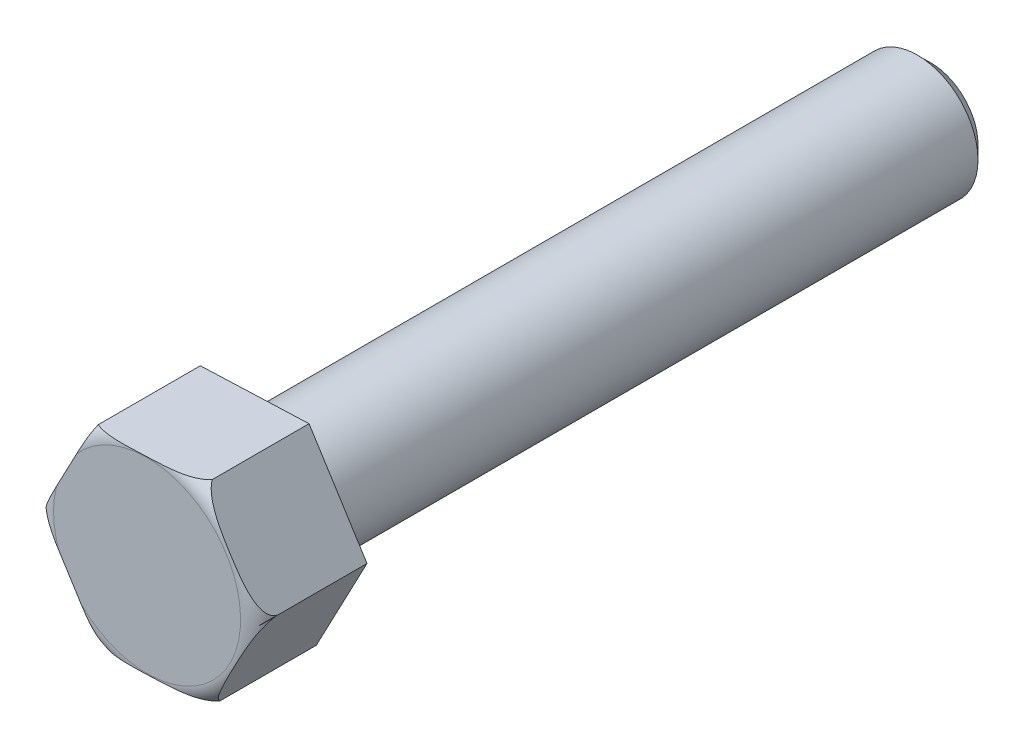
ISO-10303-21;
HEADER;
FILE_DESCRIPTION(('STEP AP214'),'2;1');
FILE_NAME('part.step','',(''),(''),'','','');
FILE_SCHEMA(('AUTOMOTIVE_DESIGN { 1 0 10303 214 1 1 1 1 }'));
ENDSEC;
DATA;
#1=APPLICATION_CONTEXT('core data for automotive mechanical design processes');
#2=APPLICATION_PROTOCOL_DEFINITION('international standard','automotive_design',2000,#1);
#3=PRODUCT_CONTEXT('',#1,'mechanical');
#4=PRODUCT('Part','Part','',(#3));
#5=PRODUCT_RELATED_PRODUCT_CATEGORY('part','',(#4));
#6=PRODUCT_DEFINITION_FORMATION('','',#4);
#7=PRODUCT_DEFINITION_CONTEXT('part definition',#1,'design');
#8=PRODUCT_DEFINITION('design','',#6,#7);
#9=PRODUCT_DEFINITION_SHAPE('','',#8);
#10=(LENGTH_UNIT() NAMED_UNIT(*) SI_UNIT(.MILLI.,.METRE.));
#11=(NAMED_UNIT(*) PLANE_ANGLE_UNIT() SI_UNIT($,.RADIAN.));
#12=(NAMED_UNIT(*) SI_UNIT($,.STERADIAN.) SOLID_ANGLE_UNIT());
#13=UNCERTAINTY_MEASURE_WITH_UNIT(LENGTH_MEASURE(1.E-05),#10,'distance_accuracy_value','');
#14=(GEOMETRIC_REPRESENTATION_CONTEXT(3) GLOBAL_UNCERTAINTY_ASSIGNED_CONTEXT((#13)) GLOBAL_UNIT_ASSIGNED_CONTEXT((#10,
#11,#12)) REPRESENTATION_CONTEXT('',''));
#15=CARTESIAN_POINT('',(0.,0.,0.));
#16=DIRECTION('',(0.,0.,1.));
#17=DIRECTION('',(1.,0.,0.));
#18=AXIS2_PLACEMENT_3D('',#15,#16,#17);
#19=CARTESIAN_POINT('',(0.,0.,29.));
#20=DIRECTION('',(0.,0.,1.));
#21=DIRECTION('',(1.,0.,0.));
#22=AXIS2_PLACEMENT_3D('',#19,#20,#21);
#23=PLANE('',#22);
#24=CARTESIAN_POINT('',(-0.134541740716779,0.,29.));
#25=DIRECTION('',(0.,0.,1.));
#26=DIRECTION('',(1.,0.,0.));
#27=AXIS2_PLACEMENT_3D('',#24,#25,#26);
#28=CIRCLE('',#27,3.47599362504416);
#29=CARTESIAN_POINT('',(-3.41445546254765,-1.15095510715806,29.));
#30=VERTEX_POINT('',#29);
#31=CARTESIAN_POINT('',(-3.49895630302121,0.8736397050853,29.));
#32=VERTEX_POINT('',#31);
#33=EDGE_CURVE('E226',#30,#32,#28,.F.);
#34=ORIENTED_EDGE('',*,*,#33,.F.);
#35=DIRECTION('',(0.53289686923062,-0.846180197572718,0.));
#36=VECTOR('',#35,1.);
#37=CARTESIAN_POINT('',(-4.04145188432738,-0.155355420440145,29.));
#38=LINE('',#37,#36);
#39=CARTESIAN_POINT('',(-2.58959470090721,-2.46074107618169,29.));
#40=VERTEX_POINT('',#39);
#41=EDGE_CURVE('E243',#30,#40,#38,.T.);
#42=ORIENTED_EDGE('',*,*,#41,.T.);
#43=CARTESIAN_POINT('',(-2.75628795762435,2.28231865774227,29.));
#44=VERTEX_POINT('',#43);
#45=EDGE_CURVE('E223',#44,#40,#28,.F.);
#46=ORIENTED_EDGE('',*,*,#45,.F.);
#47=DIRECTION('',(-0.466365112661999,-0.884592325137269,0.));
#48=VECTOR('',#47,1.);
#49=CARTESIAN_POINT('',(-2.15526768288047,3.42232228977993,29.));
#50=LINE('',#49,#48);
#51=EDGE_CURVE('E239',#44,#32,#50,.T.);
#52=ORIENTED_EDGE('',*,*,#51,.T.);
#53=EDGE_LOOP('',(#34,#42,#46,#52));
#54=FACE_BOUND('',#53,.T.);
#55=ADVANCED_FACE('F39',(#54),#23,.T.);
#56=CARTESIAN_POINT('',(0.,0.,25.));
#57=DIRECTION('',(0.,0.,-1.));
#58=DIRECTION('',(-1.,0.,0.));
#59=AXIS2_PLACEMENT_3D('',#56,#57,#58);
#60=CYLINDRICAL_SURFACE('',#59,2.25);
#61=CARTESIAN_POINT('',(0.,0.,0.5));
#62=DIRECTION('',(0.,0.,1.));
#63=DIRECTION('',(1.,0.,0.));
#64=AXIS2_PLACEMENT_3D('',#61,#62,#63);
#65=CIRCLE('',#64,2.25);
#66=CARTESIAN_POINT('',(2.25,0.,0.5));
#67=VERTEX_POINT('',#66);
#68=EDGE_CURVE('E48',#67,#67,#65,.T.);
#69=ORIENTED_EDGE('',*,*,#68,.T.);
#70=EDGE_LOOP('',(#69));
#71=FACE_BOUND('',#70,.T.);
#72=CARTESIAN_POINT('',(0.,0.,25.));
#73=DIRECTION('',(0.,0.,1.));
#74=DIRECTION('',(1.,0.,0.));
#75=AXIS2_PLACEMENT_3D('',#72,#73,#74);
#76=CIRCLE('',#75,2.25);
#77=CARTESIAN_POINT('',(2.25,0.,25.));
#78=VERTEX_POINT('',#77);
#79=EDGE_CURVE('E221',#78,#78,#76,.T.);
#80=ORIENTED_EDGE('',*,*,#79,.F.);
#81=EDGE_LOOP('',(#80));
#82=FACE_BOUND('',#81,.T.);
#83=ADVANCED_FACE('F208',(#71,#82),#60,.T.);
#84=CARTESIAN_POINT('',(0.,0.,0.));
#85=DIRECTION('',(0.,0.,1.));
#86=DIRECTION('',(1.,0.,0.));
#87=AXIS2_PLACEMENT_3D('',#84,#85,#86);
#88=PLANE('',#87);
#89=CARTESIAN_POINT('',(0.,0.,0.));
#90=DIRECTION('',(0.,0.,1.));
#91=DIRECTION('',(1.,0.,0.));
#92=AXIS2_PLACEMENT_3D('',#89,#90,#91);
#93=CIRCLE('',#92,1.75);
#94=CARTESIAN_POINT('',(1.75,0.,0.));
#95=VERTEX_POINT('',#94);
#96=EDGE_CURVE('E11',#95,#95,#93,.F.);
#97=ORIENTED_EDGE('',*,*,#96,.T.);
#98=EDGE_LOOP('',(#97));
#99=FACE_BOUND('',#98,.T.);
#100=ADVANCED_FACE('F205',(#99),#88,.F.);
#101=CARTESIAN_POINT('',(4.04145188432738,0.155355420440146,29.));
#102=DIRECTION('',(-0.846180197572718,-0.53289686923062,0.));
#103=DIRECTION('',(0.53289686923062,-0.846180197572718,0.));
#104=AXIS2_PLACEMENT_3D('',#101,#102,#103);
#105=PLANE('',#104);
#106=DIRECTION('',(0.,0.,-1.));
#107=VECTOR('',#106,1.);
#108=CARTESIAN_POINT('',(1.88618420144691,3.57767771022007,29.));
#109=LINE('',#108,#107);
#110=CARTESIAN_POINT('',(1.88618420143579,3.57767771021965,28.59903431723));
#111=VERTEX_POINT('',#110);
#112=CARTESIAN_POINT('',(1.88618420144691,3.57767771022007,25.));
#113=VERTEX_POINT('',#112);
#114=EDGE_CURVE('E224',#111,#113,#109,.T.);
#115=ORIENTED_EDGE('',*,*,#114,.F.);
#116=CARTESIAN_POINT('',(1.88605824792773,3.57787771021988,28.5987967175314));
#117=CARTESIAN_POINT('',(1.89754389041783,3.5596398038018,28.6204264055522));
#118=CARTESIAN_POINT('',(1.90980538986126,3.54016992394201,28.6404683800975));
#119=CARTESIAN_POINT('',(1.93543757539687,3.49946890077394,28.6776430461389));
#120=CARTESIAN_POINT('',(1.94880265920132,3.47824665326749,28.6947892308748));
#121=CARTESIAN_POINT('',(1.9760475484688,3.43498483824408,28.7263272101482));
#122=CARTESIAN_POINT('',(1.98991214709032,3.41296941747842,28.7407663717004));
#123=CARTESIAN_POINT('',(2.01820565504884,3.36804251410041,28.7676270409243));
#124=CARTESIAN_POINT('',(2.0326353521958,3.34512978053461,28.7800455977092));
#125=CARTESIAN_POINT('',(2.07809314796832,3.27294792166284,28.815917882112));
#126=CARTESIAN_POINT('',(2.10979695447209,3.22260584836468,28.8363522266094));
#127=CARTESIAN_POINT('',(2.17408304467043,3.12052677894972,28.8714601698475));
#128=CARTESIAN_POINT('',(2.20666625984897,3.06878830374131,28.8861273817633));
#129=CARTESIAN_POINT('',(2.27277899089453,2.96380873443182,28.9113444949774));
#130=CARTESIAN_POINT('',(2.30631537059651,2.91055674133403,28.9218294180791));
#131=CARTESIAN_POINT('',(2.37363640259678,2.80365852622343,28.9395172016005));
#132=CARTESIAN_POINT('',(2.40742115489796,2.75001214541727,28.9467186570918));
#133=CARTESIAN_POINT('',(2.4844469825085,2.62770380812154,28.9603722936265));
#134=CARTESIAN_POINT('',(2.52772473015397,2.55898362009339,28.9660692584796));
#135=CARTESIAN_POINT('',(2.61435610918697,2.42142274920297,28.9748916900608));
#136=CARTESIAN_POINT('',(2.6577097551143,2.35258204325314,28.9780165934975));
#137=CARTESIAN_POINT('',(2.74416321008174,2.21530369573572,28.9825682556101));
#138=CARTESIAN_POINT('',(2.78726287070522,2.14686628983699,28.9840057390161));
#139=CARTESIAN_POINT('',(2.87346312256001,2.00999000033916,28.9856918534697));
#140=CARTESIAN_POINT('',(2.91656371323393,1.94155111762511,28.9859406074722));
#141=CARTESIAN_POINT('',(3.0192204042425,1.77854385656686,28.9852525937358));
#142=CARTESIAN_POINT('',(3.0787762673785,1.68397585486742,28.9838269222321));
#143=CARTESIAN_POINT('',(3.19795496793975,1.49473350384183,28.977971064666));
#144=CARTESIAN_POINT('',(3.25757773849564,1.40005926069671,28.9735355895304));
#145=CARTESIAN_POINT('',(3.37445626927127,1.21446932017684,28.9595033607756));
#146=CARTESIAN_POINT('',(3.43171735430219,1.12354516760179,28.9501053258335));
#147=CARTESIAN_POINT('',(3.51716289464539,0.987867274966186,28.9294814592153));
#148=CARTESIAN_POINT('',(3.54556542883472,0.942767250215448,28.9215210116692));
#149=CARTESIAN_POINT('',(3.60209886958878,0.852998514783018,28.9027640616494));
#150=CARTESIAN_POINT('',(3.6302298776358,0.808329642958875,28.8919686649389));
#151=CARTESIAN_POINT('',(3.69163624370004,0.710823251068298,28.8642103303045));
#152=CARTESIAN_POINT('',(3.72481171773421,0.658144335515039,28.8464446425068));
#153=CARTESIAN_POINT('',(3.78987084569985,0.55483776920821,28.8038098454119));
#154=CARTESIAN_POINT('',(3.82175636447796,0.504207157288253,28.7789514417922));
#155=CARTESIAN_POINT('',(3.87090621633324,0.426162729266723,28.7311777801488));
#156=CARTESIAN_POINT('',(3.88900487572805,0.397424096959471,28.7113164594525));
#157=CARTESIAN_POINT('',(3.92365507684988,0.342403480918829,28.6672429209368));
#158=CARTESIAN_POINT('',(3.94020851689363,0.316118482872292,28.643036151381));
#159=CARTESIAN_POINT('',(3.96641130822286,0.274511401982628,28.5972783407121));
#160=CARTESIAN_POINT('',(3.97667469247709,0.258214303955872,28.5769759766737));
#161=CARTESIAN_POINT('',(3.99543148333395,0.228430633025311,28.5336472632991));
#162=CARTESIAN_POINT('',(4.00392742501646,0.214940034700247,28.5106248907424));
#163=CARTESIAN_POINT('',(4.01689369476154,0.194351058993725,28.4673796883132));
#164=CARTESIAN_POINT('',(4.02183866761014,0.186498999160716,28.4476608222074));
#165=CARTESIAN_POINT('',(4.0299227889987,0.173662325070953,28.4069730122953));
#166=CARTESIAN_POINT('',(4.0330661611034,0.168671004269159,28.3860071204826));
#167=CARTESIAN_POINT('',(4.03624027855567,0.163630863318887,28.3540066203126));
#168=CARTESIAN_POINT('',(4.0370415405843,0.162358549479494,28.3432273814894));
#169=CARTESIAN_POINT('',(4.03811211666866,0.16065859525778,28.3215676101235));
#170=CARTESIAN_POINT('',(4.03838099251025,0.160231650710169,28.3106870015363));
#171=CARTESIAN_POINT('',(4.03837642421509,0.160238904648268,28.2998));
#172=B_SPLINE_CURVE_WITH_KNOTS('',3,(#116,#117,#118,#119,#120,#121,#122,#123,#124,#125,#126,
#127,#128,#129,#130,#131,#132,#133,#134,#135,#136,#137,#138,#139,#140,#141,#142,#143,#144,#145,
#146,#147,#148,#149,#150,#151,#152,#153,#154,#155,#156,#157,#158,#159,#160,#161,#162,#163,#164,
#165,#166,#167,#168,#169,#170,#171),.UNSPECIFIED.,.F.,.F.,(4,2,2,2,2,2,2,2,2,2,2,2,2,2,2,2,2,2,
2,2,2,2,2,2,2,2,2,4),(0.,0.091389862568128,0.182341375085829,0.271511642273586,
0.360810986840683,0.549056915824058,0.7375107349661,0.928787987494082,1.12014700700023,
1.36431456889584,1.60853559020222,1.85119586517972,2.09383104032964,2.42910615715637,
2.76497197783846,3.08830804909561,3.24991914906838,3.41146730651158,3.60541778104787,
3.79907704334962,3.91686815162064,4.03451259360151,4.11821587737106,4.20179826316867,
4.26692904688313,4.33190651068713,4.36451615910714,4.39715263782286),.UNSPECIFIED.);
#173=CARTESIAN_POINT('',(4.03837645466419,0.160238856298519,28.3));
#174=VERTEX_POINT('',#173);
#175=EDGE_CURVE('E187',#111,#174,#172,.T.);
#176=ORIENTED_EDGE('',*,*,#175,.T.);
#177=DIRECTION('',(0.,0.,1.));
#178=VECTOR('',#177,1.);
#179=CARTESIAN_POINT('',(4.03837645466419,0.160238856298518,29.));
#180=LINE('',#179,#178);
#181=CARTESIAN_POINT('',(4.03837645466419,0.160238856298519,29.));
#182=VERTEX_POINT('',#181);
#183=EDGE_CURVE('E126',#174,#182,#180,.T.);
#184=ORIENTED_EDGE('',*,*,#183,.T.);
#185=DIRECTION('',(-0.53289686923062,0.846180197572718,0.));
#186=VECTOR('',#185,1.);
#187=CARTESIAN_POINT('',(4.04145188432738,0.155355420440146,29.));
#188=LINE('',#187,#186);
#189=CARTESIAN_POINT('',(4.04145188432738,0.155355420440146,29.));
#190=VERTEX_POINT('',#189);
#191=EDGE_CURVE('E244',#190,#182,#188,.T.);
#192=ORIENTED_EDGE('',*,*,#191,.F.);
#193=DIRECTION('',(0.,0.,-1.));
#194=VECTOR('',#193,1.);
#195=CARTESIAN_POINT('',(4.04145188432738,0.155355420440146,29.));
#196=LINE('',#195,#194);
#197=CARTESIAN_POINT('',(4.04145188432738,0.155355420440146,25.));
#198=VERTEX_POINT('',#197);
#199=EDGE_CURVE('E251',#190,#198,#196,.T.);
#200=ORIENTED_EDGE('',*,*,#199,.T.);
#201=DIRECTION('',(-0.53289686923062,0.846180197572718,0.));
#202=VECTOR('',#201,1.);
#203=CARTESIAN_POINT('',(4.04145188432738,0.155355420440146,25.));
#204=LINE('',#203,#202);
#205=EDGE_CURVE('E252',#198,#113,#204,.T.);
#206=ORIENTED_EDGE('',*,*,#205,.T.);
#207=EDGE_LOOP('',(#115,#176,#184,#192,#200,#206));
#208=FACE_BOUND('',#207,.T.);
#209=ADVANCED_FACE('F199',(#208),#105,.F.);
#210=CARTESIAN_POINT('',(1.88618420144691,3.57767771022007,29.));
#211=DIRECTION('',(0.038412127564552,-0.999261981892619,0.));
#212=DIRECTION('',(0.999261981892619,0.038412127564552,0.));
#213=AXIS2_PLACEMENT_3D('',#210,#211,#212);
#214=PLANE('',#213);
#215=DIRECTION('',(0.,0.,-1.));
#216=VECTOR('',#215,1.);
#217=CARTESIAN_POINT('',(-2.15526768288047,3.42232228977993,29.));
#218=LINE('',#217,#216);
#219=CARTESIAN_POINT('',(-2.15526768288047,3.42232228977992,28.791548776765));
#220=VERTEX_POINT('',#219);
#221=CARTESIAN_POINT('',(-2.15526768288047,3.42232228977993,25.));
#222=VERTEX_POINT('',#221);
#223=EDGE_CURVE('E228',#220,#222,#218,.T.);
#224=ORIENTED_EDGE('',*,*,#223,.F.);
#225=CARTESIAN_POINT('',(-2.15546768288047,3.42231460168046,28.791452365884));
#226=CARTESIAN_POINT('',(-2.11423152706038,3.42389974001889,28.8112789825461));
#227=CARTESIAN_POINT('',(-2.07200122137732,3.42552309397249,28.8288229624919));
#228=CARTESIAN_POINT('',(-1.98625531726741,3.428819209172,28.860039077984));
#229=CARTESIAN_POINT('',(-1.94274365265741,3.43049181920003,28.8737219268485));
#230=CARTESIAN_POINT('',(-1.85511481215122,3.43386031541108,28.8979527671043));
#231=CARTESIAN_POINT('',(-1.81100162971626,3.43555604808347,28.9085157376318));
#232=CARTESIAN_POINT('',(-1.72223998876899,3.43896808970688,28.927150606701));
#233=CARTESIAN_POINT('',(-1.67759129844951,3.44068440756868,28.9352213827982));
#234=CARTESIAN_POINT('',(-1.53109977994254,3.4463156143973,28.958330701919));
#235=CARTESIAN_POINT('',(-1.42861294111893,3.45025525945327,28.9692060887795));
#236=CARTESIAN_POINT('',(-1.22314784026843,3.45815344011755,28.9848361276303));
#237=CARTESIAN_POINT('',(-1.12016911329532,3.46211199359862,28.989582823425));
#238=CARTESIAN_POINT('',(-0.913760966487451,3.47004642541852,28.9958697150578));
#239=CARTESIAN_POINT('',(-0.81033124782384,3.47402231524448,28.9973984295633));
#240=CARTESIAN_POINT('',(-0.603533081248558,3.48197173961822,28.9991968758556));
#241=CARTESIAN_POINT('',(-0.50016463485671,3.48594527410757,28.9994673828916));
#242=CARTESIAN_POINT('',(-0.292416059545223,3.49393123266581,28.9997268236963));
#243=CARTESIAN_POINT('',(-0.188035926093309,3.49794365690892,28.9997129770394));
#244=CARTESIAN_POINT('',(0.0207667396174032,3.50597013522635,28.9992960424341));
#245=CARTESIAN_POINT('',(0.125189272310062,3.50998418931736,28.9988928004684));
#246=CARTESIAN_POINT('',(0.333737595552044,3.5180008905838,28.9964903888068));
#247=CARTESIAN_POINT('',(0.437863427352922,3.52200353934496,28.9944955233355));
#248=CARTESIAN_POINT('',(0.645959315665218,3.53000284878769,28.9867111858539));
#249=CARTESIAN_POINT('',(0.749929428999497,3.53399951165355,28.9809241070909));
#250=CARTESIAN_POINT('',(0.896654326857463,3.5396396897005,28.9677171313132));
#251=CARTESIAN_POINT('',(0.93966587404271,3.54129307496599,28.9632291640429));
#252=CARTESIAN_POINT('',(1.02551993511015,3.54459334777274,28.9527141133412));
#253=CARTESIAN_POINT('',(1.06836238342229,3.54624023279345,28.9466864829911));
#254=CARTESIAN_POINT('',(1.15369747009954,3.54952055596652,28.9327537852959));
#255=CARTESIAN_POINT('',(1.19619045707962,3.55115400751983,28.9248509075471));
#256=CARTESIAN_POINT('',(1.28067772984901,3.55440174030463,28.9067506056115));
#257=CARTESIAN_POINT('',(1.32267214649838,3.55601602656645,28.8965537981875));
#258=CARTESIAN_POINT('',(1.42726411075699,3.56003659369112,28.8674379492141));
#259=CARTESIAN_POINT('',(1.48938434215977,3.5624245262816,28.8467275058695));
#260=CARTESIAN_POINT('',(1.60998053901644,3.567060304067,28.7969003239148));
#261=CARTESIAN_POINT('',(1.6684749303081,3.5693088575603,28.7678312105693));
#262=CARTESIAN_POINT('',(1.7532943672204,3.57256935889996,28.7144599661541));
#263=CARTESIAN_POINT('',(1.78205483908027,3.57367492574221,28.694100864153));
#264=CARTESIAN_POINT('',(1.83671790825361,3.57577620130778,28.6494928171564));
#265=CARTESIAN_POINT('',(1.8625972946487,3.57677101779186,28.6252156703002));
#266=CARTESIAN_POINT('',(1.88638420144691,3.57768539831954,28.5988118627022));
#267=B_SPLINE_CURVE_WITH_KNOTS('',3,(#225,#226,#227,#228,#229,#230,#231,#232,#233,#234,#235,
#236,#237,#238,#239,#240,#241,#242,#243,#244,#245,#246,#247,#248,#249,#250,#251,#252,#253,#254,
#255,#256,#257,#258,#259,#260,#261,#262,#263,#264,#265,#266),.UNSPECIFIED.,.F.,.F.,(4,2,2,2,2,2,
2,2,2,2,2,2,2,2,2,2,2,2,2,2,4),(0.,0.137147803865565,0.273911241382636,0.410006959789839,
0.546163884433819,0.855188428057402,1.16461374173131,1.4751411858263,1.78547727191978,
2.09884927302768,2.41234527281357,2.7249963478009,3.03745030001164,3.16725823301767,
3.29711234064468,3.42681556632391,3.55648396063445,3.75264393358838,3.94770766951829,
4.05317697836895,4.15944240579597),.UNSPECIFIED.);
#268=EDGE_CURVE('E180',#220,#111,#267,.T.);
#269=ORIENTED_EDGE('',*,*,#268,.T.);
#270=ORIENTED_EDGE('',*,*,#114,.T.);
#271=DIRECTION('',(-0.999261981892619,-0.038412127564552,0.));
#272=VECTOR('',#271,1.);
#273=CARTESIAN_POINT('',(1.88618420144691,3.57767771022007,25.));
#274=LINE('',#273,#272);
#275=EDGE_CURVE('E255',#113,#222,#274,.T.);
#276=ORIENTED_EDGE('',*,*,#275,.T.);
#277=EDGE_LOOP('',(#224,#269,#270,#276));
#278=FACE_BOUND('',#277,.T.);
#279=ADVANCED_FACE('F195',(#278),#214,.F.);
#280=CARTESIAN_POINT('',(-2.15526768288047,3.42232228977993,29.));
#281=DIRECTION('',(0.88459232513727,-0.466365112661999,0.));
#282=DIRECTION('',(0.466365112661999,0.88459232513727,0.));
#283=AXIS2_PLACEMENT_3D('',#280,#281,#282);
#284=PLANE('',#283);
#285=DIRECTION('',(0.,0.,-1.));
#286=VECTOR('',#285,1.);
#287=CARTESIAN_POINT('',(-4.04145188432738,-0.155355420440145,29.));
#288=LINE('',#287,#286);
#289=CARTESIAN_POINT('',(-4.04145188432738,-0.155355420440148,28.8492180303302));
#290=VERTEX_POINT('',#289);
#291=CARTESIAN_POINT('',(-4.04145188432738,-0.155355420440145,25.));
#292=VERTEX_POINT('',#291);
#293=EDGE_CURVE('E241',#290,#292,#288,.T.);
#294=ORIENTED_EDGE('',*,*,#293,.F.);
#295=CARTESIAN_POINT('',(-4.04155732614491,-0.155555420440145,28.8491284712823));
#296=CARTESIAN_POINT('',(-4.01949982004243,-0.113717169507215,28.8678137912484));
#297=CARTESIAN_POINT('',(-3.99702472987737,-0.0710868532013874,28.8839695906644));
#298=CARTESIAN_POINT('',(-3.95155469614245,0.0151598272933197,28.9120382219619));
#299=CARTESIAN_POINT('',(-3.92856106429313,0.0587737034360727,28.923960708235));
#300=CARTESIAN_POINT('',(-3.88213842372463,0.146827270147157,28.9445130679633));
#301=CARTESIAN_POINT('',(-3.85870771719273,0.191270181093798,28.9531244939433));
#302=CARTESIAN_POINT('',(-3.81165703913539,0.280514997166036,28.967637090123));
#303=CARTESIAN_POINT('',(-3.78803698283964,0.325317063082318,28.9735369684688));
#304=CARTESIAN_POINT('',(-3.73658487026539,0.422910435012481,28.9840456953631));
#305=CARTESIAN_POINT('',(-3.70873555762413,0.475734472561495,28.9882508540021));
#306=CARTESIAN_POINT('',(-3.65298217946149,0.581486401863482,28.9945128204874));
#307=CARTESIAN_POINT('',(-3.62507810254078,0.634414315238496,28.9965691196022));
#308=CARTESIAN_POINT('',(-3.54128832079503,0.793345152569238,29.0005612240568));
#309=CARTESIAN_POINT('',(-3.48538505344248,0.899381388787452,29.00031112093));
#310=CARTESIAN_POINT('',(-3.3734183453143,1.11175767507466,28.9983062116039));
#311=CARTESIAN_POINT('',(-3.31735496363189,1.21809761305678,28.9965465990178));
#312=CARTESIAN_POINT('',(-3.20526767528438,1.43070261357172,28.9942109442648));
#313=CARTESIAN_POINT('',(-3.14924377727932,1.53696765967835,28.9936338622661));
#314=CARTESIAN_POINT('',(-3.03756839675202,1.74879136140715,28.9943205002001));
#315=CARTESIAN_POINT('',(-2.98191689227907,1.85435005866501,28.9955721180382));
#316=CARTESIAN_POINT('',(-2.87055921078415,2.06557115501421,28.9983828247467));
#317=CARTESIAN_POINT('',(-2.81485303997183,2.17123354232722,28.999942245819));
#318=CARTESIAN_POINT('',(-2.70364470936285,2.38217135280475,29.0000547504571));
#319=CARTESIAN_POINT('',(-2.64814265693311,2.4874465723178,28.9986202207669));
#320=CARTESIAN_POINT('',(-2.56503979634327,2.64507447088662,28.9906279814059));
#321=CARTESIAN_POINT('',(-2.5373846102343,2.69753029298403,28.9869954130599));
#322=CARTESIAN_POINT('',(-2.48218408880058,2.80223357433611,28.9770208685564));
#323=CARTESIAN_POINT('',(-2.45463871829534,2.85448110032045,28.9706798447486));
#324=CARTESIAN_POINT('',(-2.40371181804969,2.95107825966454,28.9555722795238));
#325=CARTESIAN_POINT('',(-2.38030028073785,2.99548481080535,28.9472846961322));
#326=CARTESIAN_POINT('',(-2.33379562376691,3.08369394464219,28.9274124156004));
#327=CARTESIAN_POINT('',(-2.31070227302653,3.12749696564871,28.9158302595773));
#328=CARTESIAN_POINT('',(-2.26500817934401,3.21416863871822,28.8885531674381));
#329=CARTESIAN_POINT('',(-2.2424078815467,3.2570364464391,28.8728546689092));
#330=CARTESIAN_POINT('',(-2.20913994936164,3.32013841673037,28.8454723533375));
#331=CARTESIAN_POINT('',(-2.19813300343856,3.34101617885794,28.8356805271064));
#332=CARTESIAN_POINT('',(-2.17640918586515,3.38222149584325,28.8146647775557));
#333=CARTESIAN_POINT('',(-2.16569259637532,3.40254851550439,28.8034395177862));
#334=CARTESIAN_POINT('',(-2.15516224106276,3.42252228978028,28.7914284865256));
#335=B_SPLINE_CURVE_WITH_KNOTS('',3,(#295,#296,#297,#298,#299,#300,#301,#302,#303,#304,#305,
#306,#307,#308,#309,#310,#311,#312,#313,#314,#315,#316,#317,#318,#319,#320,#321,#322,#323,#324,
#325,#326,#327,#328,#329,#330,#331,#332,#333,#334),.UNSPECIFIED.,.F.,.F.,(4,2,2,2,2,2,2,2,2,2,2,
2,2,2,2,2,2,2,2,4),(0.,0.152352136707308,0.304354556765562,0.457191988948941,0.610102161689533,
0.789638178969204,0.96921669087316,1.32876001692603,1.68945242202193,2.04982752400091,
2.40782848701379,2.76621796240309,3.12312762820237,3.30131478848969,3.47943934594678,
3.63198959200638,3.78442249301937,3.93698775219794,4.01360162068639,4.09028744826247),.UNSPECIFIED.);
#336=EDGE_CURVE('E173',#290,#32,#335,.T.);
#337=ORIENTED_EDGE('',*,*,#336,.T.);
#338=ORIENTED_EDGE('',*,*,#51,.F.);
#339=EDGE_CURVE('E188',#44,#220,#335,.T.);
#340=ORIENTED_EDGE('',*,*,#339,.T.);
#341=ORIENTED_EDGE('',*,*,#223,.T.);
#342=DIRECTION('',(-0.466365112661999,-0.884592325137269,0.));
#343=VECTOR('',#342,1.);
#344=CARTESIAN_POINT('',(-2.15526768288047,3.42232228977993,25.));
#345=LINE('',#344,#343);
#346=EDGE_CURVE('E258',#222,#292,#345,.T.);
#347=ORIENTED_EDGE('',*,*,#346,.T.);
#348=EDGE_LOOP('',(#294,#337,#338,#340,#341,#347));
#349=FACE_BOUND('',#348,.T.);
#350=ADVANCED_FACE('F198',(#349),#284,.F.);
#351=CARTESIAN_POINT('',(-4.04145188432738,-0.155355420440145,29.));
#352=DIRECTION('',(0.846180197572718,0.53289686923062,0.));
#353=DIRECTION('',(-0.53289686923062,0.846180197572718,0.));
#354=AXIS2_PLACEMENT_3D('',#351,#352,#353);
#355=PLANE('',#354);
#356=DIRECTION('',(0.,0.,-1.));
#357=VECTOR('',#356,1.);
#358=CARTESIAN_POINT('',(-1.88618420144691,-3.57767771022007,29.));
#359=LINE('',#358,#357);
#360=CARTESIAN_POINT('',(-1.88618420144682,-3.57767771022007,28.7821496192249));
#361=VERTEX_POINT('',#360);
#362=CARTESIAN_POINT('',(-1.88618420144691,-3.57767771022007,25.));
#363=VERTEX_POINT('',#362);
#364=EDGE_CURVE('E271',#361,#363,#359,.T.);
#365=ORIENTED_EDGE('',*,*,#364,.F.);
#366=CARTESIAN_POINT('',(-1.88605824792765,-3.57787771022001,28.7820188130896));
#367=CARTESIAN_POINT('',(-1.9047734472914,-3.54816008189524,28.8014268589788));
#368=CARTESIAN_POINT('',(-1.92401759842673,-3.51760253774355,28.8188704251433));
#369=CARTESIAN_POINT('',(-1.9632303238263,-3.45533714711764,28.8503304798637));
#370=CARTESIAN_POINT('',(-1.98319680353121,-3.42363262656766,28.8643560876338));
#371=CARTESIAN_POINT('',(-2.04335679347562,-3.32810533955127,28.9018927040777));
#372=CARTESIAN_POINT('',(-2.08426927969675,-3.26314092021856,28.9212981279278));
#373=CARTESIAN_POINT('',(-2.16175537606299,-3.14010172798802,28.9502827872348));
#374=CARTESIAN_POINT('',(-2.19824111810461,-3.08216647974018,28.9607793289286));
#375=CARTESIAN_POINT('',(-2.27150807096992,-2.96582681210313,28.9773190552453));
#376=CARTESIAN_POINT('',(-2.30828941988378,-2.90742217344226,28.9833600195733));
#377=CARTESIAN_POINT('',(-2.38204798934033,-2.79030187403886,28.9923011954693));
#378=CARTESIAN_POINT('',(-2.4190254706127,-2.73158579928696,28.9951928981726));
#379=CARTESIAN_POINT('',(-2.49301153440329,-2.61410426450832,28.9988966156009));
#380=CARTESIAN_POINT('',(-2.53002012108634,-2.55533879786829,28.9997082826952));
#381=CARTESIAN_POINT('',(-2.60488195385102,-2.43646664061405,29.0001631787262));
#382=CARTESIAN_POINT('',(-2.64273518663241,-2.37635997111913,28.9997792982363));
#383=CARTESIAN_POINT('',(-2.71843971008627,-2.25614971597947,28.9985692180858));
#384=CARTESIAN_POINT('',(-2.75629100070243,-2.19604613042415,28.9977430092824));
#385=CARTESIAN_POINT('',(-2.83194446138602,-2.07591695721148,28.9962323564834));
#386=CARTESIAN_POINT('',(-2.86974663015816,-2.01589137161089,28.9955477262981));
#387=CARTESIAN_POINT('',(-2.94535295046861,-1.89583705200039,28.9946663393229));
#388=CARTESIAN_POINT('',(-2.9831571020108,-1.83580831798433,28.9944695835232));
#389=CARTESIAN_POINT('',(-3.06437471461543,-1.70684389832206,28.9946722017193));
#390=CARTESIAN_POINT('',(-3.10778809791217,-1.63790833615902,28.9951643692057));
#391=CARTESIAN_POINT('',(-3.19460767657025,-1.50004862546464,28.9966222948016));
#392=CARTESIAN_POINT('',(-3.23801387221411,-1.43112447648468,28.9975880048977));
#393=CARTESIAN_POINT('',(-3.32474372823276,-1.29340723523447,28.9992596693404));
#394=CARTESIAN_POINT('',(-3.36806738536807,-1.22461414810814,28.9999661239617));
#395=CARTESIAN_POINT('',(-3.45474373773298,-1.0869818646329,29.0000315725766));
#396=CARTESIAN_POINT('',(-3.49809643557883,-1.01814266412966,28.9993898077308));
#397=CARTESIAN_POINT('',(-3.58358039986723,-0.88240375859755,28.9953939636057));
#398=CARTESIAN_POINT('',(-3.62571247990783,-0.815502761666609,28.9921149353548));
#399=CARTESIAN_POINT('',(-3.70977544818075,-0.68202023773204,28.9813359910639));
#400=CARTESIAN_POINT('',(-3.75170655741643,-0.61543835979999,28.9738433144943));
#401=CARTESIAN_POINT('',(-3.81449757258661,-0.515733301109732,28.9578749179518));
#402=CARTESIAN_POINT('',(-3.83552348032642,-0.482346528184771,28.951717615707));
#403=CARTESIAN_POINT('',(-3.8773838378832,-0.415876995948649,28.9374936105555));
#404=CARTESIAN_POINT('',(-3.89821837106584,-0.382794104262167,28.9294277844296));
#405=CARTESIAN_POINT('',(-3.93973485370923,-0.316870606651024,28.9109759999337));
#406=CARTESIAN_POINT('',(-3.96041510625307,-0.284032695239261,28.9005762386336));
#407=CARTESIAN_POINT('',(-4.00135994708848,-0.219016900423819,28.8770259446736));
#408=CARTESIAN_POINT('',(-4.02162379092559,-0.186840199129947,28.8638708886098));
#409=CARTESIAN_POINT('',(-4.04157783784668,-0.155155420440144,28.8491248324524));
#410=B_SPLINE_CURVE_WITH_KNOTS('',3,(#366,#367,#368,#369,#370,#371,#372,#373,#374,#375,#376,
#377,#378,#379,#380,#381,#382,#383,#384,#385,#386,#387,#388,#389,#390,#391,#392,#393,#394,#395,
#396,#397,#398,#399,#400,#401,#402,#403,#404,#405,#406,#407,#408,#409),.UNSPECIFIED.,.F.,.F.,(4,
2,2,2,2,2,2,2,2,2,2,2,2,2,2,2,2,2,2,2,2,4),(0.,0.120195729162586,0.240067172624802,
0.476952428724805,0.684594197738846,0.892339368625698,1.10064445597091,1.30898435450629,
1.52208254281008,1.73518513591844,1.94800567090158,2.16082663788673,2.40522853335717,
2.64960565356449,2.89350869827303,3.13754905949679,3.37488034946224,3.61180512077185,
3.73156729879422,3.85127456422789,3.97170936380945,4.09234345471957),.UNSPECIFIED.);
#411=EDGE_CURVE('E166',#361,#40,#410,.T.);
#412=ORIENTED_EDGE('',*,*,#411,.T.);
#413=ORIENTED_EDGE('',*,*,#41,.F.);
#414=EDGE_CURVE('E63',#30,#290,#410,.T.);
#415=ORIENTED_EDGE('',*,*,#414,.T.);
#416=ORIENTED_EDGE('',*,*,#293,.T.);
#417=DIRECTION('',(0.53289686923062,-0.846180197572718,0.));
#418=VECTOR('',#417,1.);
#419=CARTESIAN_POINT('',(-4.04145188432738,-0.155355420440145,25.));
#420=LINE('',#419,#418);
#421=EDGE_CURVE('E260',#292,#363,#420,.T.);
#422=ORIENTED_EDGE('',*,*,#421,.T.);
#423=EDGE_LOOP('',(#365,#412,#413,#415,#416,#422));
#424=FACE_BOUND('',#423,.T.);
#425=ADVANCED_FACE('F285',(#424),#355,.F.);
#426=CARTESIAN_POINT('',(-1.88618420144691,-3.57767771022007,29.));
#427=DIRECTION('',(-0.0384121275645519,0.999261981892619,0.));
#428=DIRECTION('',(-0.999261981892619,-0.0384121275645519,0.));
#429=AXIS2_PLACEMENT_3D('',#426,#427,#428);
#430=PLANE('',#429);
#431=DIRECTION('',(0.,0.,-1.));
#432=VECTOR('',#431,1.);
#433=CARTESIAN_POINT('',(2.15526768288047,-3.42232228977993,29.));
#434=LINE('',#433,#432);
#435=CARTESIAN_POINT('',(2.15526768287962,-3.42232228978153,28.5796479780584));
#436=VERTEX_POINT('',#435);
#437=CARTESIAN_POINT('',(2.15526768288047,-3.42232228977993,25.));
#438=VERTEX_POINT('',#437);
#439=EDGE_CURVE('E269',#436,#438,#434,.T.);
#440=ORIENTED_EDGE('',*,*,#439,.F.);
#441=CARTESIAN_POINT('',(2.15546768288047,-3.42231460168046,28.579407295902));
#442=CARTESIAN_POINT('',(2.14026370826338,-3.4228990500264,28.5977010550365));
#443=CARTESIAN_POINT('',(2.12398831344062,-3.42352468429791,28.6150352225844));
#444=CARTESIAN_POINT('',(2.08976668369394,-3.42484018076542,28.6478530574705));
#445=CARTESIAN_POINT('',(2.07182623192104,-3.42552982065422,28.6633427325561));
#446=CARTESIAN_POINT('',(2.01667379359842,-3.42764990781327,28.7068250346414));
#447=CARTESIAN_POINT('',(1.97758987356278,-3.42915231313774,28.7324376877739));
#448=CARTESIAN_POINT('',(1.90432127486249,-3.43196879451174,28.7738408605686));
#449=CARTESIAN_POINT('',(1.87064279062587,-3.43326341219571,28.790573028004));
#450=CARTESIAN_POINT('',(1.80196246985178,-3.43590351788427,28.8210813103861));
#451=CARTESIAN_POINT('',(1.76696005667656,-3.43724902805509,28.8348561194031));
#452=CARTESIAN_POINT('',(1.69574269490778,-3.43998665886127,28.8600155501551));
#453=CARTESIAN_POINT('',(1.65951929291483,-3.4413791044495,28.8713757646643));
#454=CARTESIAN_POINT('',(1.58649130687653,-3.44418633655311,28.891932691756));
#455=CARTESIAN_POINT('',(1.54968699780993,-3.44560111249817,28.901130397041));
#456=CARTESIAN_POINT('',(1.44542346345987,-3.44960905461381,28.9244960092011));
#457=CARTESIAN_POINT('',(1.37750006726158,-3.45222006374521,28.9365802833668));
#458=CARTESIAN_POINT('',(1.24100981741219,-3.45746681683253,28.9564175275993));
#459=CARTESIAN_POINT('',(1.17244245398126,-3.46010258038463,28.9641667088213));
#460=CARTESIAN_POINT('',(1.03484252980418,-3.465391989905,28.9765956453579));
#461=CARTESIAN_POINT('',(0.965809196304919,-3.46804566557827,28.9812664187538));
#462=CARTESIAN_POINT('',(0.827630261237124,-3.47335733256525,28.9885044127519));
#463=CARTESIAN_POINT('',(0.758484641916267,-3.47601532456135,28.9910712598329));
#464=CARTESIAN_POINT('',(0.61973537291999,-3.48134891546819,28.9948944485671));
#465=CARTESIAN_POINT('',(0.550131523265537,-3.48402452206622,28.9961426278976));
#466=CARTESIAN_POINT('',(0.410912169013935,-3.48937618328407,28.9978939735803));
#467=CARTESIAN_POINT('',(0.341296663970524,-3.49205223792105,28.9983970957741));
#468=CARTESIAN_POINT('',(0.202192804283473,-3.4973994594704,28.9990480947809));
#469=CARTESIAN_POINT('',(0.132704452017588,-3.50007062629137,28.9991966253016));
#470=CARTESIAN_POINT('',(-0.00627044639648883,-3.50541289050524,28.9993097401819));
#471=CARTESIAN_POINT('',(-0.0757569925480808,-3.50808398789828,28.9992743289465));
#472=CARTESIAN_POINT('',(-0.254255473870213,-3.5149455582961,28.9989178110953));
#473=CARTESIAN_POINT('',(-0.36326782075831,-3.51913604712752,28.998445655131));
#474=CARTESIAN_POINT('',(-0.581393324268552,-3.52752089996666,28.9957838937833));
#475=CARTESIAN_POINT('',(-0.690506462909075,-3.53171526328316,28.9935924378833));
#476=CARTESIAN_POINT('',(-0.907189086376662,-3.54004465109585,28.9850696211289));
#477=CARTESIAN_POINT('',(-1.0147599872011,-3.54417973002368,28.9787931262056));
#478=CARTESIAN_POINT('',(-1.17553058358701,-3.55035983170763,28.9635840739349));
#479=CARTESIAN_POINT('',(-1.22899102080369,-3.55241487750266,28.9575540630347));
#480=CARTESIAN_POINT('',(-1.33555708344743,-3.55651132995107,28.9429495843755));
#481=CARTESIAN_POINT('',(-1.38866274338538,-3.55855273793106,28.9343753679));
#482=CARTESIAN_POINT('',(-1.51757224361896,-3.56350808323287,28.9094735641295));
#483=CARTESIAN_POINT('',(-1.59307250855203,-3.56641035096678,28.8913943809959));
#484=CARTESIAN_POINT('',(-1.70464854661824,-3.57069938936213,28.8569367616737));
#485=CARTESIAN_POINT('',(-1.74180944935448,-3.5721278729452,28.8441143902748));
#486=CARTESIAN_POINT('',(-1.81504294651311,-3.57494300499848,28.8154657399872));
#487=CARTESIAN_POINT('',(-1.85111292285227,-3.57632955282828,28.7996328112114));
#488=CARTESIAN_POINT('',(-1.88638420144693,-3.57768539831954,28.7820497626766));
#489=B_SPLINE_CURVE_WITH_KNOTS('',3,(#441,#442,#443,#444,#445,#446,#447,#448,#449,#450,#451,
#452,#453,#454,#455,#456,#457,#458,#459,#460,#461,#462,#463,#464,#465,#466,#467,#468,#469,#470,
#471,#472,#473,#474,#475,#476,#477,#478,#479,#480,#481,#482,#483,#484,#485,#486,#487,#488),
.UNSPECIFIED.,.F.,.F.,(4,2,2,2,2,2,2,2,2,2,2,2,2,2,2,2,2,2,2,2,2,2,2,4),(0.,0.0712600299408919,
0.142281211225004,0.281923289854389,0.394670583504854,0.507467562910389,0.621355545880919,
0.735191145915225,0.942086089201599,1.14916157603129,1.35683860656514,1.56455249910402,
1.77354470337375,1.98254929376617,2.19116827500349,2.39978226028775,2.72705803523308,
3.05468654764215,3.3780030587995,3.53946625000236,3.70091349926908,3.93346142336054,
4.05135737101478,4.16951682429658),.UNSPECIFIED.);
#490=EDGE_CURVE('E123',#436,#361,#489,.T.);
#491=ORIENTED_EDGE('',*,*,#490,.T.);
#492=ORIENTED_EDGE('',*,*,#364,.T.);
#493=DIRECTION('',(0.999261981892619,0.0384121275645519,0.));
#494=VECTOR('',#493,1.);
#495=CARTESIAN_POINT('',(-1.88618420144691,-3.57767771022007,25.));
#496=LINE('',#495,#494);
#497=EDGE_CURVE('E263',#363,#438,#496,.T.);
#498=ORIENTED_EDGE('',*,*,#497,.T.);
#499=EDGE_LOOP('',(#440,#491,#492,#498));
#500=FACE_BOUND('',#499,.T.);
#501=ADVANCED_FACE('F288',(#500),#430,.F.);
#502=CARTESIAN_POINT('',(2.15526768288047,-3.42232228977993,29.));
#503=DIRECTION('',(-0.88459232513727,0.466365112661999,0.));
#504=DIRECTION('',(-0.466365112661999,-0.88459232513727,0.));
#505=AXIS2_PLACEMENT_3D('',#502,#503,#504);
#506=PLANE('',#505);
#507=DIRECTION('',(0.,0.,1.));
#508=VECTOR('',#507,1.);
#509=CARTESIAN_POINT('',(4.03874883233989,0.150228323713444,29.));
#510=LINE('',#509,#508);
#511=CARTESIAN_POINT('',(4.0387488323399,0.150228323713447,29.));
#512=VERTEX_POINT('',#511);
#513=CARTESIAN_POINT('',(4.03874883233989,0.150228323713444,28.3));
#514=VERTEX_POINT('',#513);
#515=EDGE_CURVE('E55',#512,#514,#510,.F.);
#516=ORIENTED_EDGE('',*,*,#515,.T.);
#517=CARTESIAN_POINT('',(4.03874880557729,0.150228272950664,28.2998));
#518=CARTESIAN_POINT('',(4.03877660030425,0.150280993451134,28.320622657545));
#519=CARTESIAN_POINT('',(4.03789105300766,0.148601304467471,28.3413961028591));
#520=CARTESIAN_POINT('',(4.03448576081864,0.142142212109414,28.3821459169807));
#521=CARTESIAN_POINT('',(4.0319797831441,0.137388922127637,28.4021275093318));
#522=CARTESIAN_POINT('',(4.02552922666285,0.125153631362421,28.4409094470686));
#523=CARTESIAN_POINT('',(4.02158854059268,0.117679014246319,28.4597128289438));
#524=CARTESIAN_POINT('',(4.01251341322584,0.100465488190473,28.4959733199335));
#525=CARTESIAN_POINT('',(4.00737632904757,0.0907215662839939,28.5134273328611));
#526=CARTESIAN_POINT('',(3.99258692890406,0.062669318152359,28.557464230638));
#527=CARTESIAN_POINT('',(3.98213741113965,0.0428488749742224,28.5828153461946));
#528=CARTESIAN_POINT('',(3.95953737222636,-1.8441700446359E-05,28.6297320441516));
#529=CARTESIAN_POINT('',(3.94738252231728,-0.0230735259055912,28.6512876679976));
#530=CARTESIAN_POINT('',(3.91291539995887,-0.0884500969226338,28.7051957163294));
#531=CARTESIAN_POINT('',(3.8895218227493,-0.132822581688856,28.734338740388));
#532=CARTESIAN_POINT('',(3.84107119754427,-0.224722790432669,28.7851987641284));
#533=CARTESIAN_POINT('',(3.81601016225639,-0.272258077429407,28.8068971398235));
#534=CARTESIAN_POINT('',(3.77215206048199,-0.355447276559832,28.839356922368));
#535=CARTESIAN_POINT('',(3.75356751440399,-0.390698084093269,28.8514792697701));
#536=CARTESIAN_POINT('',(3.71609033132757,-0.461784080058822,28.8733172992218));
#537=CARTESIAN_POINT('',(3.6971975877718,-0.497619470606865,28.8830321292495));
#538=CARTESIAN_POINT('',(3.64015763092103,-0.605811757479157,28.9092594947039));
#539=CARTESIAN_POINT('',(3.6017167504565,-0.678725676010382,28.9228085543803));
#540=CARTESIAN_POINT('',(3.52439641075033,-0.825385400814137,28.9446403924524));
#541=CARTESIAN_POINT('',(3.48551584363454,-0.89913330848094,28.9529030958943));
#542=CARTESIAN_POINT('',(3.40761858352797,-1.04688732474122,28.9658831155552));
#543=CARTESIAN_POINT('',(3.36860184556243,-1.12089351864198,28.9705991211334));
#544=CARTESIAN_POINT('',(3.28761119905005,-1.27451501040369,28.9779977012806));
#545=CARTESIAN_POINT('',(3.24563413054463,-1.35413630201297,28.980502040154));
#546=CARTESIAN_POINT('',(3.16165359482565,-1.51342895779051,28.9837944510613));
#547=CARTESIAN_POINT('',(3.11965012346546,-1.59310032982404,28.9845819668502));
#548=CARTESIAN_POINT('',(3.03559645445651,-1.75253170341144,28.9847762363965));
#549=CARTESIAN_POINT('',(2.99354625603923,-1.83229170642302,28.9841814762506));
#550=CARTESIAN_POINT('',(2.90947314007586,-1.99175996661742,28.9813502344086));
#551=CARTESIAN_POINT('',(2.86745021828755,-2.07146823184678,28.9791143935192));
#552=CARTESIAN_POINT('',(2.78292777172218,-2.23178877363599,28.9721030366601));
#553=CARTESIAN_POINT('',(2.7404287254773,-2.31240014252524,28.9672966964837));
#554=CARTESIAN_POINT('',(2.65550317477016,-2.4734852844536,28.9535702562177));
#555=CARTESIAN_POINT('',(2.61307687246865,-2.55395867403811,28.9446440430327));
#556=CARTESIAN_POINT('',(2.52884169307437,-2.71373433301357,28.920423307064));
#557=CARTESIAN_POINT('',(2.48703061559717,-2.79304077605116,28.9051688428566));
#558=CARTESIAN_POINT('',(2.42514062516657,-2.910432512807,28.8749627171136));
#559=CARTESIAN_POINT('',(2.40467544138624,-2.94925047755842,28.8636933783889));
#560=CARTESIAN_POINT('',(2.36416779525372,-3.02608459723276,28.8381149885941));
#561=CARTESIAN_POINT('',(2.34412507007637,-3.06410125067735,28.8238078926858));
#562=CARTESIAN_POINT('',(2.30150856017572,-3.14493542235686,28.7888087805969));
#563=CARTESIAN_POINT('',(2.27904977166384,-3.18753481800223,28.7674583138871));
#564=CARTESIAN_POINT('',(2.23581270979253,-3.2695460406568,28.7182884220201));
#565=CARTESIAN_POINT('',(2.21502473647044,-3.30897626636755,28.690510618501));
#566=CARTESIAN_POINT('',(2.18847763557118,-3.35933029387206,28.6466721472201));
#567=CARTESIAN_POINT('',(2.18144788284509,-3.37266419287153,28.6341433858632));
#568=CARTESIAN_POINT('',(2.16788884661933,-3.39838271052201,28.6077740962362));
#569=CARTESIAN_POINT('',(2.16136200703312,-3.41076269360523,28.5939278137597));
#570=CARTESIAN_POINT('',(2.15516224106296,-3.4225222897799,28.5794009489649));
#571=B_SPLINE_CURVE_WITH_KNOTS('',3,(#517,#518,#519,#520,#521,#522,#523,#524,#525,#526,#527,
#528,#529,#530,#531,#532,#533,#534,#535,#536,#537,#538,#539,#540,#541,#542,#543,#544,#545,#546,
#547,#548,#549,#550,#551,#552,#553,#554,#555,#556,#557,#558,#559,#560,#561,#562,#563,#564,#565,
#566,#567,#568,#569,#570),.UNSPECIFIED.,.F.,.F.,(4,2,2,2,2,2,2,2,2,2,2,2,2,2,2,2,2,2,2,2,2,2,2,
2,2,2,4),(0.,0.0623005415408791,0.124078609555535,0.185690291802876,0.247439389269637,
0.34835511576049,0.449531800853685,0.622589559072067,0.796077145265902,0.920951470426712,
1.04586992578225,1.29616392034787,1.54740285209954,1.79873458070214,2.06884286977747,
2.33903866003483,2.6095305149023,2.87991680467766,3.15362062605918,3.42773188314397,
3.70013383836815,3.83596897107402,3.97171694113473,4.12942269556072,4.28613444030999,
4.34487129851286,4.40387761918928),.UNSPECIFIED.);
#572=EDGE_CURVE('E118',#514,#436,#571,.T.);
#573=ORIENTED_EDGE('',*,*,#572,.T.);
#574=ORIENTED_EDGE('',*,*,#439,.T.);
#575=DIRECTION('',(0.466365112661999,0.884592325137269,0.));
#576=VECTOR('',#575,1.);
#577=CARTESIAN_POINT('',(2.15526768288047,-3.42232228977993,25.));
#578=LINE('',#577,#576);
#579=EDGE_CURVE('E248',#438,#198,#578,.T.);
#580=ORIENTED_EDGE('',*,*,#579,.T.);
#581=ORIENTED_EDGE('',*,*,#199,.F.);
#582=DIRECTION('',(0.466365112661999,0.884592325137269,0.));
#583=VECTOR('',#582,1.);
#584=CARTESIAN_POINT('',(2.15526768288047,-3.42232228977993,29.));
#585=LINE('',#584,#583);
#586=EDGE_CURVE('E135',#512,#190,#585,.T.);
#587=ORIENTED_EDGE('',*,*,#586,.F.);
#588=EDGE_LOOP('',(#516,#573,#574,#580,#581,#587));
#589=FACE_BOUND('',#588,.T.);
#590=ADVANCED_FACE('F133',(#589),#506,.F.);
#591=CARTESIAN_POINT('',(-0.134541740716779,0.,29.));
#592=DIRECTION('',(0.,0.,1.));
#593=DIRECTION('',(1.,0.,0.));
#594=AXIS2_PLACEMENT_3D('',#591,#592,#593);
#595=CIRCLE('',#594,4.17599362504416);
#596=EDGE_CURVE('E130',#512,#182,#595,.T.);
#597=ORIENTED_EDGE('',*,*,#596,.F.);
#598=ORIENTED_EDGE('',*,*,#586,.T.);
#599=ORIENTED_EDGE('',*,*,#191,.T.);
#600=EDGE_LOOP('',(#597,#598,#599));
#601=FACE_BOUND('',#600,.T.);
#602=ADVANCED_FACE('F159',(#601),#23,.T.);
#603=CARTESIAN_POINT('',(0.,0.,25.));
#604=DIRECTION('',(0.,0.,1.));
#605=DIRECTION('',(1.,0.,0.));
#606=AXIS2_PLACEMENT_3D('',#603,#604,#605);
#607=PLANE('',#606);
#608=ORIENTED_EDGE('',*,*,#79,.T.);
#609=EDGE_LOOP('',(#608));
#610=FACE_BOUND('',#609,.T.);
#611=ORIENTED_EDGE('',*,*,#205,.F.);
#612=ORIENTED_EDGE('',*,*,#579,.F.);
#613=ORIENTED_EDGE('',*,*,#497,.F.);
#614=ORIENTED_EDGE('',*,*,#421,.F.);
#615=ORIENTED_EDGE('',*,*,#346,.F.);
#616=ORIENTED_EDGE('',*,*,#275,.F.);
#617=EDGE_LOOP('',(#611,#612,#613,#614,#615,#616));
#618=FACE_BOUND('',#617,.T.);
#619=ADVANCED_FACE('F280',(#610,#618),#607,.F.);
#620=CARTESIAN_POINT('',(-0.134541740716779,0.,29.));
#621=DIRECTION('',(0.,0.,1.));
#622=DIRECTION('',(1.,0.,0.));
#623=AXIS2_PLACEMENT_3D('',#620,#621,#622);
#624=CYLINDRICAL_SURFACE('',#623,4.17599362504416);
#625=CARTESIAN_POINT('',(-0.134541740716779,0.,28.3));
#626=DIRECTION('',(0.,0.,1.));
#627=DIRECTION('',(1.,0.,0.));
#628=AXIS2_PLACEMENT_3D('',#625,#626,#627);
#629=CIRCLE('',#628,4.17599362504416);
#630=EDGE_CURVE('E120',#514,#174,#629,.T.);
#631=ORIENTED_EDGE('',*,*,#630,.F.);
#632=ORIENTED_EDGE('',*,*,#515,.F.);
#633=ORIENTED_EDGE('',*,*,#596,.T.);
#634=ORIENTED_EDGE('',*,*,#183,.F.);
#635=EDGE_LOOP('',(#631,#632,#633,#634));
#636=FACE_BOUND('',#635,.T.);
#637=ADVANCED_FACE('F128',(#636),#624,.F.);
#638=CARTESIAN_POINT('',(-0.134541740716779,0.,28.3));
#639=DIRECTION('',(0.,0.,1.));
#640=DIRECTION('',(1.,0.,0.));
#641=AXIS2_PLACEMENT_3D('',#638,#639,#640);
#642=TOROIDAL_SURFACE('',#641,3.47599362504416,0.699999999999998);
#643=ORIENTED_EDGE('',*,*,#268,.F.);
#644=ORIENTED_EDGE('',*,*,#339,.F.);
#645=ORIENTED_EDGE('',*,*,#45,.T.);
#646=ORIENTED_EDGE('',*,*,#411,.F.);
#647=ORIENTED_EDGE('',*,*,#490,.F.);
#648=ORIENTED_EDGE('',*,*,#572,.F.);
#649=ORIENTED_EDGE('',*,*,#630,.T.);
#650=ORIENTED_EDGE('',*,*,#175,.F.);
#651=EDGE_LOOP('',(#643,#644,#645,#646,#647,#648,#649,#650));
#652=FACE_BOUND('',#651,.T.);
#653=ADVANCED_FACE('F119',(#652),#642,.T.);
#654=ORIENTED_EDGE('',*,*,#414,.F.);
#655=ORIENTED_EDGE('',*,*,#33,.T.);
#656=ORIENTED_EDGE('',*,*,#336,.F.);
#657=EDGE_LOOP('',(#654,#655,#656));
#658=FACE_BOUND('',#657,.T.);
#659=ADVANCED_FACE('F158',(#658),#642,.T.);
#660=CARTESIAN_POINT('',(0.,0.,0.5));
#661=DIRECTION('',(0.,0.,1.));
#662=DIRECTION('',(1.,0.,0.));
#663=AXIS2_PLACEMENT_3D('',#660,#661,#662);
#664=CONICAL_SURFACE('',#663,2.25,0.78539816339745);
#665=ORIENTED_EDGE('',*,*,#96,.F.);
#666=EDGE_LOOP('',(#665));
#667=FACE_BOUND('',#666,.T.);
#668=ORIENTED_EDGE('',*,*,#68,.F.);
#669=EDGE_LOOP('',(#668));
#670=FACE_BOUND('',#669,.T.);
#671=ADVANCED_FACE('F42',(#667,#670),#664,.T.);
#672=CLOSED_SHELL('',(#55,#83,#100,#209,#279,#350,#425,#501,#590,#602,#619,#637,#653,#659,#671));
#673=MANIFOLD_SOLID_BREP('B2',#672);
#674=ADVANCED_BREP_SHAPE_REPRESENTATION('',(#18,#673),#14);
#675=SHAPE_DEFINITION_REPRESENTATION(#9,#674);
ENDSEC;
END-ISO-10303-21;
